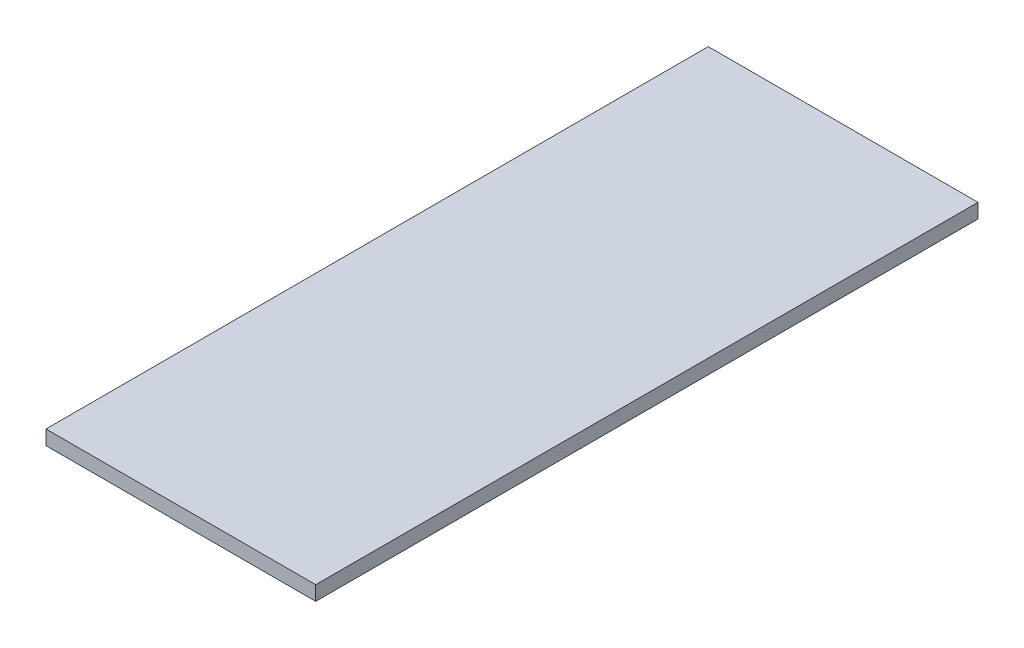
ISO-10303-21;
HEADER;
FILE_DESCRIPTION(('STEP AP214'),'2;1');
FILE_NAME('part.step','',(''),(''),'','','');
FILE_SCHEMA(('AUTOMOTIVE_DESIGN { 1 0 10303 214 1 1 1 1 }'));
ENDSEC;
DATA;
#1=APPLICATION_CONTEXT('core data for automotive mechanical design processes');
#2=APPLICATION_PROTOCOL_DEFINITION('international standard','automotive_design',2000,#1);
#3=PRODUCT_CONTEXT('',#1,'mechanical');
#4=PRODUCT('Part','Part','',(#3));
#5=PRODUCT_RELATED_PRODUCT_CATEGORY('part','',(#4));
#6=PRODUCT_DEFINITION_FORMATION('','',#4);
#7=PRODUCT_DEFINITION_CONTEXT('part definition',#1,'design');
#8=PRODUCT_DEFINITION('design','',#6,#7);
#9=PRODUCT_DEFINITION_SHAPE('','',#8);
#10=(LENGTH_UNIT() NAMED_UNIT(*) SI_UNIT(.MILLI.,.METRE.));
#11=(NAMED_UNIT(*) PLANE_ANGLE_UNIT() SI_UNIT($,.RADIAN.));
#12=(NAMED_UNIT(*) SI_UNIT($,.STERADIAN.) SOLID_ANGLE_UNIT());
#13=UNCERTAINTY_MEASURE_WITH_UNIT(LENGTH_MEASURE(1.E-05),#10,'distance_accuracy_value','');
#14=(GEOMETRIC_REPRESENTATION_CONTEXT(3) GLOBAL_UNCERTAINTY_ASSIGNED_CONTEXT((#13)) GLOBAL_UNIT_ASSIGNED_CONTEXT((#10,
#11,#12)) REPRESENTATION_CONTEXT('',''));
#15=CARTESIAN_POINT('',(0.,0.,0.));
#16=DIRECTION('',(0.,0.,1.));
#17=DIRECTION('',(1.,0.,0.));
#18=AXIS2_PLACEMENT_3D('',#15,#16,#17);
#19=CARTESIAN_POINT('',(-26.0601874226439,6.,243.374876721479));
#20=DIRECTION('',(1.,0.,0.));
#21=DIRECTION('',(0.,0.,-1.));
#22=AXIS2_PLACEMENT_3D('',#19,#20,#21);
#23=PLANE('',#22);
#24=DIRECTION('',(0.,0.,1.));
#25=VECTOR('',#24,1.);
#26=CARTESIAN_POINT('',(-26.0601874226439,0.,243.374876721479));
#27=LINE('',#26,#25);
#28=CARTESIAN_POINT('',(-26.0601874226439,0.,-31.6251232785211));
#29=VERTEX_POINT('',#28);
#30=CARTESIAN_POINT('',(-26.0601874226439,0.,243.374876721479));
#31=VERTEX_POINT('',#30);
#32=EDGE_CURVE('E111',#29,#31,#27,.T.);
#33=ORIENTED_EDGE('',*,*,#32,.T.);
#34=DIRECTION('',(0.,-1.,0.));
#35=VECTOR('',#34,1.);
#36=CARTESIAN_POINT('',(-26.0601874226439,6.,243.374876721479));
#37=LINE('',#36,#35);
#38=CARTESIAN_POINT('',(-26.0601874226439,6.,243.374876721479));
#39=VERTEX_POINT('',#38);
#40=EDGE_CURVE('E11',#39,#31,#37,.T.);
#41=ORIENTED_EDGE('',*,*,#40,.F.);
#42=DIRECTION('',(0.,0.,1.));
#43=VECTOR('',#42,1.);
#44=CARTESIAN_POINT('',(-26.0601874226439,6.,243.374876721479));
#45=LINE('',#44,#43);
#46=CARTESIAN_POINT('',(-26.0601874226439,6.,-31.6251232785211));
#47=VERTEX_POINT('',#46);
#48=EDGE_CURVE('E95',#47,#39,#45,.T.);
#49=ORIENTED_EDGE('',*,*,#48,.F.);
#50=DIRECTION('',(0.,-1.,0.));
#51=VECTOR('',#50,1.);
#52=CARTESIAN_POINT('',(-26.0601874226439,6.,-31.6251232785211));
#53=LINE('',#52,#51);
#54=EDGE_CURVE('E107',#47,#29,#53,.T.);
#55=ORIENTED_EDGE('',*,*,#54,.T.);
#56=EDGE_LOOP('',(#33,#41,#49,#55));
#57=FACE_BOUND('',#56,.T.);
#58=ADVANCED_FACE('F43',(#57),#23,.F.);
#59=CARTESIAN_POINT('',(85.9398125773561,6.,243.374876721479));
#60=DIRECTION('',(0.,0.,-1.));
#61=DIRECTION('',(-1.,0.,0.));
#62=AXIS2_PLACEMENT_3D('',#59,#60,#61);
#63=PLANE('',#62);
#64=DIRECTION('',(1.,0.,0.));
#65=VECTOR('',#64,1.);
#66=CARTESIAN_POINT('',(85.9398125773561,0.,243.374876721479));
#67=LINE('',#66,#65);
#68=CARTESIAN_POINT('',(85.9398125773561,0.,243.374876721479));
#69=VERTEX_POINT('',#68);
#70=EDGE_CURVE('E100',#31,#69,#67,.T.);
#71=ORIENTED_EDGE('',*,*,#70,.T.);
#72=DIRECTION('',(0.,-1.,0.));
#73=VECTOR('',#72,1.);
#74=CARTESIAN_POINT('',(85.9398125773561,6.,243.374876721479));
#75=LINE('',#74,#73);
#76=CARTESIAN_POINT('',(85.9398125773561,6.,243.374876721479));
#77=VERTEX_POINT('',#76);
#78=EDGE_CURVE('E52',#77,#69,#75,.T.);
#79=ORIENTED_EDGE('',*,*,#78,.F.);
#80=DIRECTION('',(1.,0.,0.));
#81=VECTOR('',#80,1.);
#82=CARTESIAN_POINT('',(85.9398125773561,6.,243.374876721479));
#83=LINE('',#82,#81);
#84=EDGE_CURVE('E90',#39,#77,#83,.T.);
#85=ORIENTED_EDGE('',*,*,#84,.F.);
#86=ORIENTED_EDGE('',*,*,#40,.T.);
#87=EDGE_LOOP('',(#71,#79,#85,#86));
#88=FACE_BOUND('',#87,.T.);
#89=ADVANCED_FACE('F99',(#88),#63,.F.);
#90=CARTESIAN_POINT('',(85.9398125773561,6.,-31.6251232785211));
#91=DIRECTION('',(-1.,0.,0.));
#92=DIRECTION('',(0.,0.,1.));
#93=AXIS2_PLACEMENT_3D('',#90,#91,#92);
#94=PLANE('',#93);
#95=DIRECTION('',(0.,0.,-1.));
#96=VECTOR('',#95,1.);
#97=CARTESIAN_POINT('',(85.9398125773561,0.,-31.6251232785211));
#98=LINE('',#97,#96);
#99=CARTESIAN_POINT('',(85.9398125773561,0.,-31.6251232785211));
#100=VERTEX_POINT('',#99);
#101=EDGE_CURVE('E77',#69,#100,#98,.T.);
#102=ORIENTED_EDGE('',*,*,#101,.T.);
#103=DIRECTION('',(0.,-1.,0.));
#104=VECTOR('',#103,1.);
#105=CARTESIAN_POINT('',(85.9398125773561,6.,-31.6251232785211));
#106=LINE('',#105,#104);
#107=CARTESIAN_POINT('',(85.9398125773561,6.,-31.6251232785211));
#108=VERTEX_POINT('',#107);
#109=EDGE_CURVE('E102',#108,#100,#106,.T.);
#110=ORIENTED_EDGE('',*,*,#109,.F.);
#111=DIRECTION('',(0.,0.,-1.));
#112=VECTOR('',#111,1.);
#113=CARTESIAN_POINT('',(85.9398125773561,6.,-31.6251232785211));
#114=LINE('',#113,#112);
#115=EDGE_CURVE('E93',#77,#108,#114,.T.);
#116=ORIENTED_EDGE('',*,*,#115,.F.);
#117=ORIENTED_EDGE('',*,*,#78,.T.);
#118=EDGE_LOOP('',(#102,#110,#116,#117));
#119=FACE_BOUND('',#118,.T.);
#120=ADVANCED_FACE('F103',(#119),#94,.F.);
#121=CARTESIAN_POINT('',(-26.0601874226439,6.,-31.6251232785211));
#122=DIRECTION('',(0.,0.,1.));
#123=DIRECTION('',(1.,0.,0.));
#124=AXIS2_PLACEMENT_3D('',#121,#122,#123);
#125=PLANE('',#124);
#126=DIRECTION('',(-1.,0.,0.));
#127=VECTOR('',#126,1.);
#128=CARTESIAN_POINT('',(-26.0601874226439,0.,-31.6251232785211));
#129=LINE('',#128,#127);
#130=EDGE_CURVE('E83',#100,#29,#129,.T.);
#131=ORIENTED_EDGE('',*,*,#130,.T.);
#132=ORIENTED_EDGE('',*,*,#54,.F.);
#133=DIRECTION('',(-1.,0.,0.));
#134=VECTOR('',#133,1.);
#135=CARTESIAN_POINT('',(-26.0601874226439,6.,-31.6251232785211));
#136=LINE('',#135,#134);
#137=EDGE_CURVE('E60',#108,#47,#136,.T.);
#138=ORIENTED_EDGE('',*,*,#137,.F.);
#139=ORIENTED_EDGE('',*,*,#109,.T.);
#140=EDGE_LOOP('',(#131,#132,#138,#139));
#141=FACE_BOUND('',#140,.T.);
#142=ADVANCED_FACE('F124',(#141),#125,.F.);
#143=CARTESIAN_POINT('',(0.,6.,0.));
#144=DIRECTION('',(0.,-1.,0.));
#145=DIRECTION('',(0.,0.,-1.));
#146=AXIS2_PLACEMENT_3D('',#143,#144,#145);
#147=PLANE('',#146);
#148=ORIENTED_EDGE('',*,*,#48,.T.);
#149=ORIENTED_EDGE('',*,*,#84,.T.);
#150=ORIENTED_EDGE('',*,*,#115,.T.);
#151=ORIENTED_EDGE('',*,*,#137,.T.);
#152=EDGE_LOOP('',(#148,#149,#150,#151));
#153=FACE_BOUND('',#152,.T.);
#154=ADVANCED_FACE('F91',(#153),#147,.F.);
#155=CARTESIAN_POINT('',(0.,0.,0.));
#156=DIRECTION('',(0.,-1.,0.));
#157=DIRECTION('',(0.,0.,-1.));
#158=AXIS2_PLACEMENT_3D('',#155,#156,#157);
#159=PLANE('',#158);
#160=ORIENTED_EDGE('',*,*,#32,.F.);
#161=ORIENTED_EDGE('',*,*,#130,.F.);
#162=ORIENTED_EDGE('',*,*,#101,.F.);
#163=ORIENTED_EDGE('',*,*,#70,.F.);
#164=EDGE_LOOP('',(#160,#161,#162,#163));
#165=FACE_BOUND('',#164,.T.);
#166=ADVANCED_FACE('F127',(#165),#159,.T.);
#167=CLOSED_SHELL('',(#58,#89,#120,#142,#154,#166));
#168=MANIFOLD_SOLID_BREP('B2',#167);
#169=ADVANCED_BREP_SHAPE_REPRESENTATION('',(#18,#168),#14);
#170=SHAPE_DEFINITION_REPRESENTATION(#9,#169);
ENDSEC;
END-ISO-10303-21;
